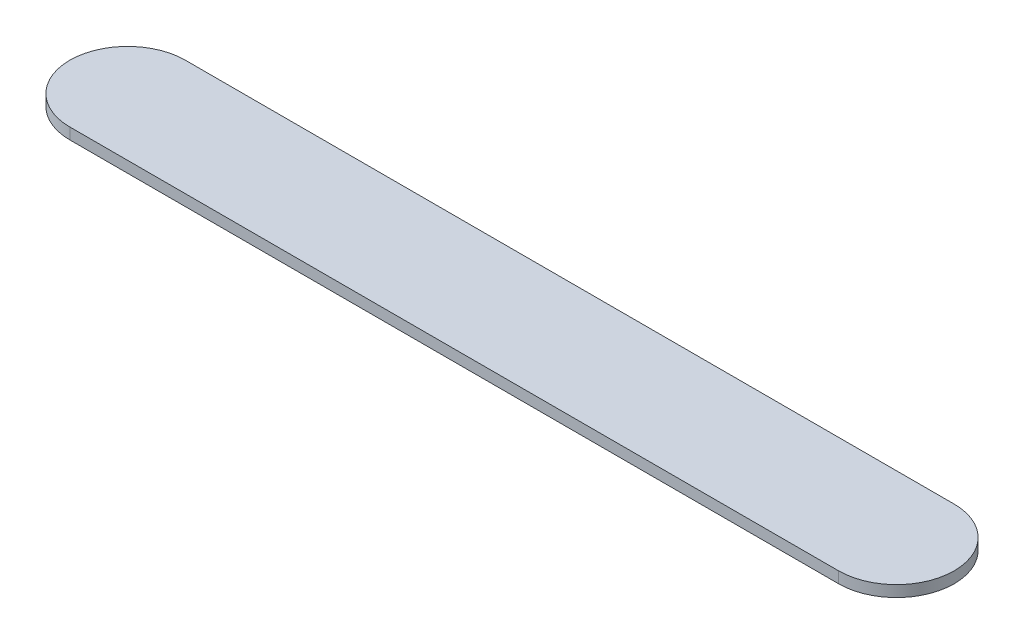
ISO-10303-21;
HEADER;
FILE_DESCRIPTION(('STEP AP214'),'2;1');
FILE_NAME('part.step','',(''),(''),'','','');
FILE_SCHEMA(('AUTOMOTIVE_DESIGN { 1 0 10303 214 1 1 1 1 }'));
ENDSEC;
DATA;
#1=APPLICATION_CONTEXT('core data for automotive mechanical design processes');
#2=APPLICATION_PROTOCOL_DEFINITION('international standard','automotive_design',2000,#1);
#3=PRODUCT_CONTEXT('',#1,'mechanical');
#4=PRODUCT('Part','Part','',(#3));
#5=PRODUCT_RELATED_PRODUCT_CATEGORY('part','',(#4));
#6=PRODUCT_DEFINITION_FORMATION('','',#4);
#7=PRODUCT_DEFINITION_CONTEXT('part definition',#1,'design');
#8=PRODUCT_DEFINITION('design','',#6,#7);
#9=PRODUCT_DEFINITION_SHAPE('','',#8);
#10=(LENGTH_UNIT() NAMED_UNIT(*) SI_UNIT(.MILLI.,.METRE.));
#11=(NAMED_UNIT(*) PLANE_ANGLE_UNIT() SI_UNIT($,.RADIAN.));
#12=(NAMED_UNIT(*) SI_UNIT($,.STERADIAN.) SOLID_ANGLE_UNIT());
#13=UNCERTAINTY_MEASURE_WITH_UNIT(LENGTH_MEASURE(1.E-05),#10,'distance_accuracy_value','');
#14=(GEOMETRIC_REPRESENTATION_CONTEXT(3) GLOBAL_UNCERTAINTY_ASSIGNED_CONTEXT((#13)) GLOBAL_UNIT_ASSIGNED_CONTEXT((#10,
#11,#12)) REPRESENTATION_CONTEXT('',''));
#15=CARTESIAN_POINT('',(0.,0.,0.));
#16=DIRECTION('',(0.,0.,1.));
#17=DIRECTION('',(1.,0.,0.));
#18=AXIS2_PLACEMENT_3D('',#15,#16,#17);
#19=CARTESIAN_POINT('',(-68.5046357399436,2.,-3.22666762543212));
#20=DIRECTION('',(0.,-1.,0.));
#21=DIRECTION('',(0.,0.,-1.));
#22=AXIS2_PLACEMENT_3D('',#19,#20,#21);
#23=CYLINDRICAL_SURFACE('',#22,10.3005158811872);
#24=CARTESIAN_POINT('',(-68.5046357399436,0.,-3.22666762543212));
#25=DIRECTION('',(0.,1.,0.));
#26=DIRECTION('',(0.,0.,1.));
#27=AXIS2_PLACEMENT_3D('',#24,#25,#26);
#28=CIRCLE('',#27,10.3005158811872);
#29=CARTESIAN_POINT('',(-68.5046357399436,0.,-13.5271835066193));
#30=VERTEX_POINT('',#29);
#31=CARTESIAN_POINT('',(-68.5046357399436,0.,7.07384825575505));
#32=VERTEX_POINT('',#31);
#33=EDGE_CURVE('E82',#30,#32,#28,.T.);
#34=ORIENTED_EDGE('',*,*,#33,.T.);
#35=DIRECTION('',(0.,-1.,0.));
#36=VECTOR('',#35,1.);
#37=CARTESIAN_POINT('',(-68.5046357399436,2.,7.07384825575505));
#38=LINE('',#37,#36);
#39=CARTESIAN_POINT('',(-68.5046357399436,2.,7.07384825575505));
#40=VERTEX_POINT('',#39);
#41=EDGE_CURVE('E11',#40,#32,#38,.T.);
#42=ORIENTED_EDGE('',*,*,#41,.F.);
#43=CARTESIAN_POINT('',(-68.5046357399436,2.,-3.22666762543212));
#44=DIRECTION('',(0.,1.,0.));
#45=DIRECTION('',(0.,0.,1.));
#46=AXIS2_PLACEMENT_3D('',#43,#44,#45);
#47=CIRCLE('',#46,10.3005158811872);
#48=CARTESIAN_POINT('',(-68.5046357399436,2.,-13.5271835066193));
#49=VERTEX_POINT('',#48);
#50=EDGE_CURVE('E84',#49,#40,#47,.T.);
#51=ORIENTED_EDGE('',*,*,#50,.F.);
#52=DIRECTION('',(0.,-1.,0.));
#53=VECTOR('',#52,1.);
#54=CARTESIAN_POINT('',(-68.5046357399436,2.,-13.5271835066193));
#55=LINE('',#54,#53);
#56=EDGE_CURVE('E45',#49,#30,#55,.T.);
#57=ORIENTED_EDGE('',*,*,#56,.T.);
#58=EDGE_LOOP('',(#34,#42,#51,#57));
#59=FACE_BOUND('',#58,.T.);
#60=ADVANCED_FACE('F37',(#59),#23,.T.);
#61=CARTESIAN_POINT('',(-68.5046357399436,2.,7.07384825575505));
#62=DIRECTION('',(0.,0.,-1.));
#63=DIRECTION('',(-1.,0.,0.));
#64=AXIS2_PLACEMENT_3D('',#61,#62,#63);
#65=PLANE('',#64);
#66=DIRECTION('',(1.,0.,0.));
#67=VECTOR('',#66,1.);
#68=CARTESIAN_POINT('',(-68.5046357399436,0.,7.07384825575505));
#69=LINE('',#68,#67);
#70=CARTESIAN_POINT('',(68.5046357399436,0.,7.07384825575505));
#71=VERTEX_POINT('',#70);
#72=EDGE_CURVE('E65',#32,#71,#69,.T.);
#73=ORIENTED_EDGE('',*,*,#72,.T.);
#74=DIRECTION('',(0.,-1.,0.));
#75=VECTOR('',#74,1.);
#76=CARTESIAN_POINT('',(68.5046357399436,2.,7.07384825575505));
#77=LINE('',#76,#75);
#78=CARTESIAN_POINT('',(68.5046357399436,2.,7.07384825575505));
#79=VERTEX_POINT('',#78);
#80=EDGE_CURVE('E91',#79,#71,#77,.T.);
#81=ORIENTED_EDGE('',*,*,#80,.F.);
#82=DIRECTION('',(1.,0.,0.));
#83=VECTOR('',#82,1.);
#84=CARTESIAN_POINT('',(-68.5046357399436,2.,7.07384825575505));
#85=LINE('',#84,#83);
#86=EDGE_CURVE('E102',#40,#79,#85,.T.);
#87=ORIENTED_EDGE('',*,*,#86,.F.);
#88=ORIENTED_EDGE('',*,*,#41,.T.);
#89=EDGE_LOOP('',(#73,#81,#87,#88));
#90=FACE_BOUND('',#89,.T.);
#91=ADVANCED_FACE('F111',(#90),#65,.F.);
#92=CARTESIAN_POINT('',(0.,2.,-13.5271835066193));
#93=DIRECTION('',(0.,0.,1.));
#94=DIRECTION('',(1.,0.,0.));
#95=AXIS2_PLACEMENT_3D('',#92,#93,#94);
#96=PLANE('',#95);
#97=DIRECTION('',(-1.,0.,0.));
#98=VECTOR('',#97,1.);
#99=CARTESIAN_POINT('',(0.,0.,-13.5271835066193));
#100=LINE('',#99,#98);
#101=CARTESIAN_POINT('',(68.5046357399436,0.,-13.5271835066193));
#102=VERTEX_POINT('',#101);
#103=EDGE_CURVE('E77',#102,#30,#100,.T.);
#104=ORIENTED_EDGE('',*,*,#103,.T.);
#105=ORIENTED_EDGE('',*,*,#56,.F.);
#106=DIRECTION('',(-1.,0.,0.));
#107=VECTOR('',#106,1.);
#108=CARTESIAN_POINT('',(0.,2.,-13.5271835066193));
#109=LINE('',#108,#107);
#110=CARTESIAN_POINT('',(68.5046357399436,2.,-13.5271835066193));
#111=VERTEX_POINT('',#110);
#112=EDGE_CURVE('E53',#111,#49,#109,.T.);
#113=ORIENTED_EDGE('',*,*,#112,.F.);
#114=DIRECTION('',(0.,-1.,0.));
#115=VECTOR('',#114,1.);
#116=CARTESIAN_POINT('',(68.5046357399436,2.,-13.5271835066193));
#117=LINE('',#116,#115);
#118=EDGE_CURVE('E87',#111,#102,#117,.T.);
#119=ORIENTED_EDGE('',*,*,#118,.T.);
#120=EDGE_LOOP('',(#104,#105,#113,#119));
#121=FACE_BOUND('',#120,.T.);
#122=ADVANCED_FACE('F88',(#121),#96,.F.);
#123=CARTESIAN_POINT('',(-68.5046357399436,2.,-3.22666762543212));
#124=DIRECTION('',(0.,1.,0.));
#125=DIRECTION('',(0.,0.,1.));
#126=AXIS2_PLACEMENT_3D('',#123,#124,#125);
#127=PLANE('',#126);
#128=ORIENTED_EDGE('',*,*,#50,.T.);
#129=ORIENTED_EDGE('',*,*,#86,.T.);
#130=CARTESIAN_POINT('',(68.5046357399436,2.,-3.22666762543212));
#131=DIRECTION('',(0.,-1.,0.));
#132=DIRECTION('',(0.,0.,1.));
#133=AXIS2_PLACEMENT_3D('',#130,#131,#132);
#134=CIRCLE('',#133,10.3005158811872);
#135=EDGE_CURVE('E92',#111,#79,#134,.T.);
#136=ORIENTED_EDGE('',*,*,#135,.F.);
#137=ORIENTED_EDGE('',*,*,#112,.T.);
#138=EDGE_LOOP('',(#128,#129,#136,#137));
#139=FACE_BOUND('',#138,.T.);
#140=ADVANCED_FACE('F109',(#139),#127,.T.);
#141=CARTESIAN_POINT('',(-68.5046357399436,0.,-3.22666762543212));
#142=DIRECTION('',(0.,1.,0.));
#143=DIRECTION('',(0.,0.,1.));
#144=AXIS2_PLACEMENT_3D('',#141,#142,#143);
#145=PLANE('',#144);
#146=ORIENTED_EDGE('',*,*,#33,.F.);
#147=ORIENTED_EDGE('',*,*,#103,.F.);
#148=CARTESIAN_POINT('',(68.5046357399436,0.,-3.22666762543212));
#149=DIRECTION('',(0.,-1.,0.));
#150=DIRECTION('',(0.,0.,1.));
#151=AXIS2_PLACEMENT_3D('',#148,#149,#150);
#152=CIRCLE('',#151,10.3005158811872);
#153=EDGE_CURVE('E80',#102,#71,#152,.T.);
#154=ORIENTED_EDGE('',*,*,#153,.T.);
#155=ORIENTED_EDGE('',*,*,#72,.F.);
#156=EDGE_LOOP('',(#146,#147,#154,#155));
#157=FACE_BOUND('',#156,.T.);
#158=ADVANCED_FACE('F78',(#157),#145,.F.);
#159=CARTESIAN_POINT('',(68.5046357399436,2.,-3.22666762543212));
#160=DIRECTION('',(0.,-1.,0.));
#161=DIRECTION('',(0.,0.,-1.));
#162=AXIS2_PLACEMENT_3D('',#159,#160,#161);
#163=CYLINDRICAL_SURFACE('',#162,10.3005158811872);
#164=ORIENTED_EDGE('',*,*,#153,.F.);
#165=ORIENTED_EDGE('',*,*,#118,.F.);
#166=ORIENTED_EDGE('',*,*,#135,.T.);
#167=ORIENTED_EDGE('',*,*,#80,.T.);
#168=EDGE_LOOP('',(#164,#165,#166,#167));
#169=FACE_BOUND('',#168,.T.);
#170=ADVANCED_FACE('F95',(#169),#163,.T.);
#171=CLOSED_SHELL('',(#60,#91,#122,#140,#158,#170));
#172=MANIFOLD_SOLID_BREP('B2',#171);
#173=ADVANCED_BREP_SHAPE_REPRESENTATION('',(#18,#172),#14);
#174=SHAPE_DEFINITION_REPRESENTATION(#9,#173);
ENDSEC;
END-ISO-10303-21;
